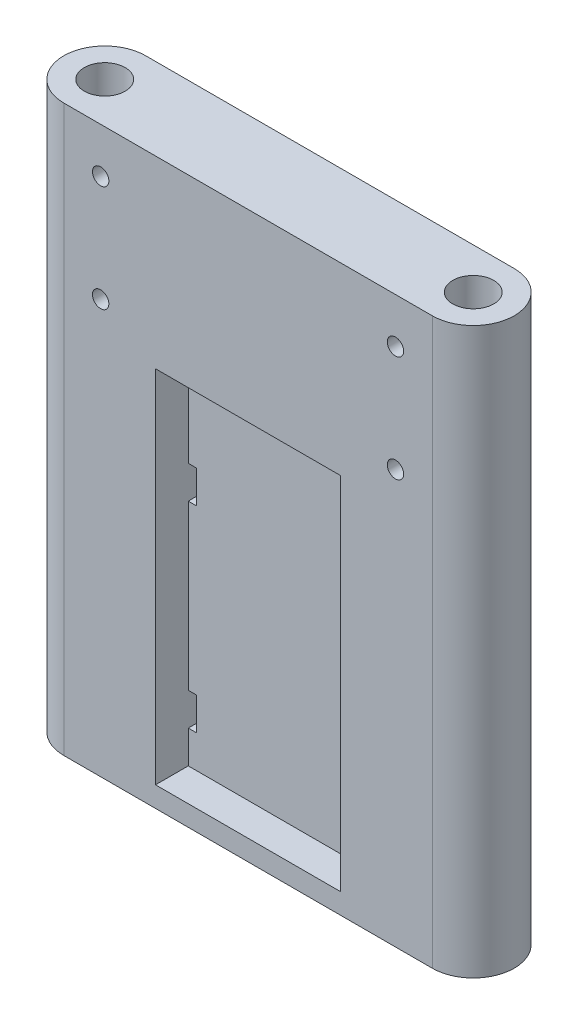
ISO-10303-21;
HEADER;
FILE_DESCRIPTION(('STEP AP214'),'2;1');
FILE_NAME('part.step','',(''),(''),'','','');
FILE_SCHEMA(('AUTOMOTIVE_DESIGN { 1 0 10303 214 1 1 1 1 }'));
ENDSEC;
DATA;
#1=APPLICATION_CONTEXT('core data for automotive mechanical design processes');
#2=APPLICATION_PROTOCOL_DEFINITION('international standard','automotive_design',2000,#1);
#3=PRODUCT_CONTEXT('',#1,'mechanical');
#4=PRODUCT('Part','Part','',(#3));
#5=PRODUCT_RELATED_PRODUCT_CATEGORY('part','',(#4));
#6=PRODUCT_DEFINITION_FORMATION('','',#4);
#7=PRODUCT_DEFINITION_CONTEXT('part definition',#1,'design');
#8=PRODUCT_DEFINITION('design','',#6,#7);
#9=PRODUCT_DEFINITION_SHAPE('','',#8);
#10=(LENGTH_UNIT() NAMED_UNIT(*) SI_UNIT(.MILLI.,.METRE.));
#11=(NAMED_UNIT(*) PLANE_ANGLE_UNIT() SI_UNIT($,.RADIAN.));
#12=(NAMED_UNIT(*) SI_UNIT($,.STERADIAN.) SOLID_ANGLE_UNIT());
#13=UNCERTAINTY_MEASURE_WITH_UNIT(LENGTH_MEASURE(1.E-05),#10,'distance_accuracy_value','');
#14=(GEOMETRIC_REPRESENTATION_CONTEXT(3) GLOBAL_UNCERTAINTY_ASSIGNED_CONTEXT((#13)) GLOBAL_UNIT_ASSIGNED_CONTEXT((#10,
#11,#12)) REPRESENTATION_CONTEXT('',''));
#15=CARTESIAN_POINT('',(0.,0.,0.));
#16=DIRECTION('',(0.,0.,1.));
#17=DIRECTION('',(1.,0.,0.));
#18=AXIS2_PLACEMENT_3D('',#15,#16,#17);
#19=CARTESIAN_POINT('',(0.,0.,1.27));
#20=DIRECTION('',(0.,0.,1.));
#21=DIRECTION('',(1.,0.,0.));
#22=AXIS2_PLACEMENT_3D('',#19,#20,#21);
#23=PLANE('',#22);
#24=DIRECTION('',(0.,-1.,0.));
#25=VECTOR('',#24,1.);
#26=CARTESIAN_POINT('',(-14.351,15.24,1.27));
#27=LINE('',#26,#25);
#28=CARTESIAN_POINT('',(-14.351,-5.07999999999999,1.27));
#29=VERTEX_POINT('',#28);
#30=CARTESIAN_POINT('',(-14.351,-30.48,1.27));
#31=VERTEX_POINT('',#30);
#32=EDGE_CURVE('E358',#29,#31,#27,.T.);
#33=ORIENTED_EDGE('',*,*,#32,.T.);
#34=DIRECTION('',(1.,0.,0.));
#35=VECTOR('',#34,1.);
#36=CARTESIAN_POINT('',(-13.081,-30.48,1.27));
#37=LINE('',#36,#35);
#38=CARTESIAN_POINT('',(-13.081,-30.48,1.27));
#39=VERTEX_POINT('',#38);
#40=EDGE_CURVE('E253',#31,#39,#37,.T.);
#41=ORIENTED_EDGE('',*,*,#40,.T.);
#42=DIRECTION('',(0.,-1.,0.));
#43=VECTOR('',#42,1.);
#44=CARTESIAN_POINT('',(-13.081,-35.56,1.27));
#45=LINE('',#44,#43);
#46=CARTESIAN_POINT('',(-13.081,-35.56,1.27));
#47=VERTEX_POINT('',#46);
#48=EDGE_CURVE('E239',#39,#47,#45,.T.);
#49=ORIENTED_EDGE('',*,*,#48,.T.);
#50=DIRECTION('',(-1.,0.,0.));
#51=VECTOR('',#50,1.);
#52=CARTESIAN_POINT('',(-13.081,-35.56,1.27));
#53=LINE('',#52,#51);
#54=CARTESIAN_POINT('',(-14.351,-35.56,1.27));
#55=VERTEX_POINT('',#54);
#56=EDGE_CURVE('E245',#47,#55,#53,.T.);
#57=ORIENTED_EDGE('',*,*,#56,.T.);
#58=CARTESIAN_POINT('',(-14.351,-40.64,1.27));
#59=VERTEX_POINT('',#58);
#60=EDGE_CURVE('E353',#55,#59,#27,.T.);
#61=ORIENTED_EDGE('',*,*,#60,.T.);
#62=DIRECTION('',(1.,0.,0.));
#63=VECTOR('',#62,1.);
#64=CARTESIAN_POINT('',(-14.351,-40.64,1.27));
#65=LINE('',#64,#63);
#66=CARTESIAN_POINT('',(14.351,-40.64,1.27));
#67=VERTEX_POINT('',#66);
#68=EDGE_CURVE('E357',#59,#67,#65,.T.);
#69=ORIENTED_EDGE('',*,*,#68,.T.);
#70=DIRECTION('',(0.,1.,0.));
#71=VECTOR('',#70,1.);
#72=CARTESIAN_POINT('',(14.351,15.24,1.27));
#73=LINE('',#72,#71);
#74=CARTESIAN_POINT('',(14.351,-35.56,1.27));
#75=VERTEX_POINT('',#74);
#76=EDGE_CURVE('E345',#67,#75,#73,.T.);
#77=ORIENTED_EDGE('',*,*,#76,.T.);
#78=DIRECTION('',(1.,0.,0.));
#79=VECTOR('',#78,1.);
#80=CARTESIAN_POINT('',(13.081,-35.56,1.27));
#81=LINE('',#80,#79);
#82=CARTESIAN_POINT('',(13.081,-35.56,1.27));
#83=VERTEX_POINT('',#82);
#84=EDGE_CURVE('E282',#83,#75,#81,.T.);
#85=ORIENTED_EDGE('',*,*,#84,.F.);
#86=DIRECTION('',(0.,-1.,0.));
#87=VECTOR('',#86,1.);
#88=CARTESIAN_POINT('',(13.081,-35.56,1.27));
#89=LINE('',#88,#87);
#90=CARTESIAN_POINT('',(13.081,-30.48,1.27));
#91=VERTEX_POINT('',#90);
#92=EDGE_CURVE('E279',#91,#83,#89,.T.);
#93=ORIENTED_EDGE('',*,*,#92,.F.);
#94=DIRECTION('',(-1.,0.,0.));
#95=VECTOR('',#94,1.);
#96=CARTESIAN_POINT('',(13.081,-30.48,1.27));
#97=LINE('',#96,#95);
#98=CARTESIAN_POINT('',(14.351,-30.48,1.27));
#99=VERTEX_POINT('',#98);
#100=EDGE_CURVE('E276',#99,#91,#97,.T.);
#101=ORIENTED_EDGE('',*,*,#100,.F.);
#102=CARTESIAN_POINT('',(14.351,-5.07999999999999,1.27));
#103=VERTEX_POINT('',#102);
#104=EDGE_CURVE('E349',#99,#103,#73,.T.);
#105=ORIENTED_EDGE('',*,*,#104,.T.);
#106=DIRECTION('',(1.,0.,0.));
#107=VECTOR('',#106,1.);
#108=CARTESIAN_POINT('',(13.081,-5.07999999999999,1.27));
#109=LINE('',#108,#107);
#110=CARTESIAN_POINT('',(13.081,-5.07999999999999,1.27));
#111=VERTEX_POINT('',#110);
#112=EDGE_CURVE('E299',#111,#103,#109,.T.);
#113=ORIENTED_EDGE('',*,*,#112,.F.);
#114=DIRECTION('',(0.,-1.,0.));
#115=VECTOR('',#114,1.);
#116=CARTESIAN_POINT('',(13.081,-5.07999999999999,1.27));
#117=LINE('',#116,#115);
#118=CARTESIAN_POINT('',(13.081,0.,1.27));
#119=VERTEX_POINT('',#118);
#120=EDGE_CURVE('E297',#119,#111,#117,.T.);
#121=ORIENTED_EDGE('',*,*,#120,.F.);
#122=DIRECTION('',(-1.,0.,0.));
#123=VECTOR('',#122,1.);
#124=CARTESIAN_POINT('',(13.081,0.,1.27));
#125=LINE('',#124,#123);
#126=CARTESIAN_POINT('',(14.351,0.,1.27));
#127=VERTEX_POINT('',#126);
#128=EDGE_CURVE('E259',#127,#119,#125,.T.);
#129=ORIENTED_EDGE('',*,*,#128,.F.);
#130=CARTESIAN_POINT('',(14.351,15.24,1.27));
#131=VERTEX_POINT('',#130);
#132=EDGE_CURVE('E350',#127,#131,#73,.T.);
#133=ORIENTED_EDGE('',*,*,#132,.T.);
#134=DIRECTION('',(-1.,0.,0.));
#135=VECTOR('',#134,1.);
#136=CARTESIAN_POINT('',(-14.351,15.24,1.27));
#137=LINE('',#136,#135);
#138=CARTESIAN_POINT('',(-14.351,15.24,1.27));
#139=VERTEX_POINT('',#138);
#140=EDGE_CURVE('E348',#131,#139,#137,.T.);
#141=ORIENTED_EDGE('',*,*,#140,.T.);
#142=CARTESIAN_POINT('',(-14.351,0.,1.27));
#143=VERTEX_POINT('',#142);
#144=EDGE_CURVE('E354',#139,#143,#27,.T.);
#145=ORIENTED_EDGE('',*,*,#144,.T.);
#146=DIRECTION('',(1.,0.,0.));
#147=VECTOR('',#146,1.);
#148=CARTESIAN_POINT('',(-13.081,0.,1.27));
#149=LINE('',#148,#147);
#150=CARTESIAN_POINT('',(-13.081,0.,1.27));
#151=VERTEX_POINT('',#150);
#152=EDGE_CURVE('E267',#143,#151,#149,.T.);
#153=ORIENTED_EDGE('',*,*,#152,.T.);
#154=DIRECTION('',(0.,-1.,0.));
#155=VECTOR('',#154,1.);
#156=CARTESIAN_POINT('',(-13.081,-5.07999999999999,1.27));
#157=LINE('',#156,#155);
#158=CARTESIAN_POINT('',(-13.081,-5.07999999999999,1.27));
#159=VERTEX_POINT('',#158);
#160=EDGE_CURVE('E264',#151,#159,#157,.T.);
#161=ORIENTED_EDGE('',*,*,#160,.T.);
#162=DIRECTION('',(-1.,0.,0.));
#163=VECTOR('',#162,1.);
#164=CARTESIAN_POINT('',(-13.081,-5.07999999999999,1.27));
#165=LINE('',#164,#163);
#166=EDGE_CURVE('E262',#159,#29,#165,.T.);
#167=ORIENTED_EDGE('',*,*,#166,.T.);
#168=EDGE_LOOP('',(#33,#41,#49,#57,#61,#69,#77,#85,#93,#101,#105,#113,#121,#129,#133,#141,#145,
#153,#161,#167));
#169=FACE_BOUND('',#168,.T.);
#170=ADVANCED_FACE('F48',(#169),#23,.T.);
#171=CARTESIAN_POINT('',(0.,0.,-1.27));
#172=DIRECTION('',(0.,0.,-1.));
#173=DIRECTION('',(1.,0.,0.));
#174=AXIS2_PLACEMENT_3D('',#171,#172,#173);
#175=PLANE('',#174);
#176=DIRECTION('',(0.,1.,0.));
#177=VECTOR('',#176,1.);
#178=CARTESIAN_POINT('',(-13.081,0.,-1.27));
#179=LINE('',#178,#177);
#180=CARTESIAN_POINT('',(-13.081,-35.56,-1.27));
#181=VERTEX_POINT('',#180);
#182=CARTESIAN_POINT('',(-13.081,-30.48,-1.27));
#183=VERTEX_POINT('',#182);
#184=EDGE_CURVE('E56',#181,#183,#179,.T.);
#185=ORIENTED_EDGE('',*,*,#184,.T.);
#186=DIRECTION('',(-1.,0.,0.));
#187=VECTOR('',#186,1.);
#188=CARTESIAN_POINT('',(0.,-30.48,-1.27));
#189=LINE('',#188,#187);
#190=CARTESIAN_POINT('',(-14.351,-30.48,-1.27));
#191=VERTEX_POINT('',#190);
#192=EDGE_CURVE('E13',#183,#191,#189,.T.);
#193=ORIENTED_EDGE('',*,*,#192,.T.);
#194=DIRECTION('',(0.,-1.,0.));
#195=VECTOR('',#194,1.);
#196=CARTESIAN_POINT('',(-14.351,15.24,-1.27));
#197=LINE('',#196,#195);
#198=CARTESIAN_POINT('',(-14.351,-5.07999999999999,-1.27));
#199=VERTEX_POINT('',#198);
#200=EDGE_CURVE('E322',#199,#191,#197,.T.);
#201=ORIENTED_EDGE('',*,*,#200,.F.);
#202=DIRECTION('',(1.,0.,0.));
#203=VECTOR('',#202,1.);
#204=CARTESIAN_POINT('',(0.,-5.07999999999999,-1.27));
#205=LINE('',#204,#203);
#206=CARTESIAN_POINT('',(-13.081,-5.07999999999999,-1.27));
#207=VERTEX_POINT('',#206);
#208=EDGE_CURVE('E460',#199,#207,#205,.T.);
#209=ORIENTED_EDGE('',*,*,#208,.T.);
#210=DIRECTION('',(0.,1.,0.));
#211=VECTOR('',#210,1.);
#212=CARTESIAN_POINT('',(-13.081,0.,-1.27));
#213=LINE('',#212,#211);
#214=CARTESIAN_POINT('',(-13.081,0.,-1.27));
#215=VERTEX_POINT('',#214);
#216=EDGE_CURVE('E463',#207,#215,#213,.T.);
#217=ORIENTED_EDGE('',*,*,#216,.T.);
#218=DIRECTION('',(-1.,0.,0.));
#219=VECTOR('',#218,1.);
#220=CARTESIAN_POINT('',(0.,0.,-1.27));
#221=LINE('',#220,#219);
#222=CARTESIAN_POINT('',(-14.351,0.,-1.27));
#223=VERTEX_POINT('',#222);
#224=EDGE_CURVE('E466',#215,#223,#221,.T.);
#225=ORIENTED_EDGE('',*,*,#224,.T.);
#226=CARTESIAN_POINT('',(-14.351,15.24,-1.27));
#227=VERTEX_POINT('',#226);
#228=EDGE_CURVE('E318',#227,#223,#197,.T.);
#229=ORIENTED_EDGE('',*,*,#228,.F.);
#230=DIRECTION('',(-1.,0.,0.));
#231=VECTOR('',#230,1.);
#232=CARTESIAN_POINT('',(-14.351,15.24,-1.27));
#233=LINE('',#232,#231);
#234=CARTESIAN_POINT('',(14.351,15.24,-1.27));
#235=VERTEX_POINT('',#234);
#236=EDGE_CURVE('E321',#235,#227,#233,.T.);
#237=ORIENTED_EDGE('',*,*,#236,.F.);
#238=DIRECTION('',(0.,1.,0.));
#239=VECTOR('',#238,1.);
#240=CARTESIAN_POINT('',(14.351,15.24,-1.27));
#241=LINE('',#240,#239);
#242=CARTESIAN_POINT('',(14.351,0.,-1.27));
#243=VERTEX_POINT('',#242);
#244=EDGE_CURVE('E315',#243,#235,#241,.T.);
#245=ORIENTED_EDGE('',*,*,#244,.F.);
#246=DIRECTION('',(1.,0.,0.));
#247=VECTOR('',#246,1.);
#248=CARTESIAN_POINT('',(0.,0.,-1.27));
#249=LINE('',#248,#247);
#250=CARTESIAN_POINT('',(13.081,0.,-1.27));
#251=VERTEX_POINT('',#250);
#252=EDGE_CURVE('E446',#251,#243,#249,.T.);
#253=ORIENTED_EDGE('',*,*,#252,.F.);
#254=DIRECTION('',(0.,1.,0.));
#255=VECTOR('',#254,1.);
#256=CARTESIAN_POINT('',(13.081,0.,-1.27));
#257=LINE('',#256,#255);
#258=CARTESIAN_POINT('',(13.081,-5.07999999999999,-1.27));
#259=VERTEX_POINT('',#258);
#260=EDGE_CURVE('E448',#259,#251,#257,.T.);
#261=ORIENTED_EDGE('',*,*,#260,.F.);
#262=DIRECTION('',(-1.,0.,0.));
#263=VECTOR('',#262,1.);
#264=CARTESIAN_POINT('',(0.,-5.07999999999999,-1.27));
#265=LINE('',#264,#263);
#266=CARTESIAN_POINT('',(14.351,-5.07999999999999,-1.27));
#267=VERTEX_POINT('',#266);
#268=EDGE_CURVE('E451',#267,#259,#265,.T.);
#269=ORIENTED_EDGE('',*,*,#268,.F.);
#270=CARTESIAN_POINT('',(14.351,-30.48,-1.27));
#271=VERTEX_POINT('',#270);
#272=EDGE_CURVE('E314',#271,#267,#241,.T.);
#273=ORIENTED_EDGE('',*,*,#272,.F.);
#274=DIRECTION('',(1.,0.,0.));
#275=VECTOR('',#274,1.);
#276=CARTESIAN_POINT('',(0.,-30.48,-1.27));
#277=LINE('',#276,#275);
#278=CARTESIAN_POINT('',(13.081,-30.48,-1.27));
#279=VERTEX_POINT('',#278);
#280=EDGE_CURVE('E453',#279,#271,#277,.T.);
#281=ORIENTED_EDGE('',*,*,#280,.F.);
#282=DIRECTION('',(0.,1.,0.));
#283=VECTOR('',#282,1.);
#284=CARTESIAN_POINT('',(13.081,0.,-1.27));
#285=LINE('',#284,#283);
#286=CARTESIAN_POINT('',(13.081,-35.56,-1.27));
#287=VERTEX_POINT('',#286);
#288=EDGE_CURVE('E455',#287,#279,#285,.T.);
#289=ORIENTED_EDGE('',*,*,#288,.F.);
#290=DIRECTION('',(-1.,0.,0.));
#291=VECTOR('',#290,1.);
#292=CARTESIAN_POINT('',(0.,-35.56,-1.27));
#293=LINE('',#292,#291);
#294=CARTESIAN_POINT('',(14.351,-35.56,-1.27));
#295=VERTEX_POINT('',#294);
#296=EDGE_CURVE('E458',#295,#287,#293,.T.);
#297=ORIENTED_EDGE('',*,*,#296,.F.);
#298=CARTESIAN_POINT('',(14.351,-40.64,-1.27));
#299=VERTEX_POINT('',#298);
#300=EDGE_CURVE('E310',#299,#295,#241,.T.);
#301=ORIENTED_EDGE('',*,*,#300,.F.);
#302=DIRECTION('',(1.,0.,0.));
#303=VECTOR('',#302,1.);
#304=CARTESIAN_POINT('',(-14.351,-40.64,-1.27));
#305=LINE('',#304,#303);
#306=CARTESIAN_POINT('',(-14.351,-40.64,-1.27));
#307=VERTEX_POINT('',#306);
#308=EDGE_CURVE('E313',#307,#299,#305,.T.);
#309=ORIENTED_EDGE('',*,*,#308,.F.);
#310=CARTESIAN_POINT('',(-14.351,-35.56,-1.27));
#311=VERTEX_POINT('',#310);
#312=EDGE_CURVE('E317',#311,#307,#197,.T.);
#313=ORIENTED_EDGE('',*,*,#312,.F.);
#314=DIRECTION('',(1.,0.,0.));
#315=VECTOR('',#314,1.);
#316=CARTESIAN_POINT('',(0.,-35.56,-1.27));
#317=LINE('',#316,#315);
#318=EDGE_CURVE('E469',#311,#181,#317,.T.);
#319=ORIENTED_EDGE('',*,*,#318,.T.);
#320=EDGE_LOOP('',(#185,#193,#201,#209,#217,#225,#229,#237,#245,#253,#261,#269,#273,#281,#289,
#297,#301,#309,#313,#319));
#321=FACE_BOUND('',#320,.T.);
#322=ADVANCED_FACE('F471',(#321),#175,.T.);
#323=CARTESIAN_POINT('',(-28.575,43.815,-6.35));
#324=DIRECTION('',(0.,0.,1.));
#325=DIRECTION('',(1.,0.,0.));
#326=AXIS2_PLACEMENT_3D('',#323,#324,#325);
#327=PLANE('',#326);
#328=DIRECTION('',(-1.,0.,0.));
#329=VECTOR('',#328,1.);
#330=CARTESIAN_POINT('',(-28.575,-43.815,-6.35));
#331=LINE('',#330,#329);
#332=CARTESIAN_POINT('',(28.575,-43.815,-6.35));
#333=VERTEX_POINT('',#332);
#334=CARTESIAN_POINT('',(-28.575,-43.815,-6.35));
#335=VERTEX_POINT('',#334);
#336=EDGE_CURVE('E421',#333,#335,#331,.T.);
#337=ORIENTED_EDGE('',*,*,#336,.T.);
#338=DIRECTION('',(0.,-1.,0.));
#339=VECTOR('',#338,1.);
#340=CARTESIAN_POINT('',(-28.575,43.815,-6.35));
#341=LINE('',#340,#339);
#342=CARTESIAN_POINT('',(-28.575,43.815,-6.35));
#343=VERTEX_POINT('',#342);
#344=EDGE_CURVE('E427',#343,#335,#341,.T.);
#345=ORIENTED_EDGE('',*,*,#344,.F.);
#346=DIRECTION('',(-1.,0.,0.));
#347=VECTOR('',#346,1.);
#348=CARTESIAN_POINT('',(-28.575,43.815,-6.35));
#349=LINE('',#348,#347);
#350=CARTESIAN_POINT('',(28.575,43.815,-6.35));
#351=VERTEX_POINT('',#350);
#352=EDGE_CURVE('E425',#351,#343,#349,.T.);
#353=ORIENTED_EDGE('',*,*,#352,.F.);
#354=DIRECTION('',(0.,-1.,0.));
#355=VECTOR('',#354,1.);
#356=CARTESIAN_POINT('',(28.575,43.815,-6.35));
#357=LINE('',#356,#355);
#358=EDGE_CURVE('E437',#351,#333,#357,.T.);
#359=ORIENTED_EDGE('',*,*,#358,.T.);
#360=EDGE_LOOP('',(#337,#345,#353,#359));
#361=FACE_BOUND('',#360,.T.);
#362=CARTESIAN_POINT('',(-22.86,36.83,-6.35));
#363=DIRECTION('',(0.,0.,-1.));
#364=DIRECTION('',(-1.,0.,0.));
#365=AXIS2_PLACEMENT_3D('',#362,#363,#364);
#366=CIRCLE('',#365,1.27);
#367=CARTESIAN_POINT('',(-24.13,36.83,-6.35));
#368=VERTEX_POINT('',#367);
#369=EDGE_CURVE('E399',#368,#368,#366,.T.);
#370=ORIENTED_EDGE('',*,*,#369,.F.);
#371=EDGE_LOOP('',(#370));
#372=FACE_BOUND('',#371,.T.);
#373=CARTESIAN_POINT('',(22.86,20.32,-6.35));
#374=DIRECTION('',(0.,0.,-1.));
#375=DIRECTION('',(-1.,0.,0.));
#376=AXIS2_PLACEMENT_3D('',#373,#374,#375);
#377=CIRCLE('',#376,1.27);
#378=CARTESIAN_POINT('',(21.59,20.32,-6.35));
#379=VERTEX_POINT('',#378);
#380=EDGE_CURVE('E392',#379,#379,#377,.T.);
#381=ORIENTED_EDGE('',*,*,#380,.F.);
#382=EDGE_LOOP('',(#381));
#383=FACE_BOUND('',#382,.T.);
#384=CARTESIAN_POINT('',(22.86,36.83,-6.35));
#385=DIRECTION('',(0.,0.,-1.));
#386=DIRECTION('',(-1.,0.,0.));
#387=AXIS2_PLACEMENT_3D('',#384,#385,#386);
#388=CIRCLE('',#387,1.27);
#389=CARTESIAN_POINT('',(21.59,36.83,-6.35));
#390=VERTEX_POINT('',#389);
#391=EDGE_CURVE('E395',#390,#390,#388,.T.);
#392=ORIENTED_EDGE('',*,*,#391,.F.);
#393=EDGE_LOOP('',(#392));
#394=FACE_BOUND('',#393,.T.);
#395=CARTESIAN_POINT('',(-22.86,20.32,-6.35));
#396=DIRECTION('',(0.,0.,-1.));
#397=DIRECTION('',(-1.,0.,0.));
#398=AXIS2_PLACEMENT_3D('',#395,#396,#397);
#399=CIRCLE('',#398,1.27);
#400=CARTESIAN_POINT('',(-24.13,20.32,-6.35));
#401=VERTEX_POINT('',#400);
#402=EDGE_CURVE('E396',#401,#401,#399,.T.);
#403=ORIENTED_EDGE('',*,*,#402,.F.);
#404=EDGE_LOOP('',(#403));
#405=FACE_BOUND('',#404,.T.);
#406=DIRECTION('',(0.,1.,0.));
#407=VECTOR('',#406,1.);
#408=CARTESIAN_POINT('',(14.351,15.24,-6.35));
#409=LINE('',#408,#407);
#410=CARTESIAN_POINT('',(14.351,-40.64,-6.35));
#411=VERTEX_POINT('',#410);
#412=CARTESIAN_POINT('',(14.351,15.24,-6.35));
#413=VERTEX_POINT('',#412);
#414=EDGE_CURVE('E288',#411,#413,#409,.T.);
#415=ORIENTED_EDGE('',*,*,#414,.T.);
#416=DIRECTION('',(-1.,0.,0.));
#417=VECTOR('',#416,1.);
#418=CARTESIAN_POINT('',(-14.351,15.24,-6.35));
#419=LINE('',#418,#417);
#420=CARTESIAN_POINT('',(-14.351,15.24,-6.35));
#421=VERTEX_POINT('',#420);
#422=EDGE_CURVE('E331',#413,#421,#419,.T.);
#423=ORIENTED_EDGE('',*,*,#422,.T.);
#424=DIRECTION('',(0.,-1.,0.));
#425=VECTOR('',#424,1.);
#426=CARTESIAN_POINT('',(-14.351,15.24,-6.35));
#427=LINE('',#426,#425);
#428=CARTESIAN_POINT('',(-14.351,-40.64,-6.35));
#429=VERTEX_POINT('',#428);
#430=EDGE_CURVE('E329',#421,#429,#427,.T.);
#431=ORIENTED_EDGE('',*,*,#430,.T.);
#432=DIRECTION('',(1.,0.,0.));
#433=VECTOR('',#432,1.);
#434=CARTESIAN_POINT('',(-14.351,-40.64,-6.35));
#435=LINE('',#434,#433);
#436=EDGE_CURVE('E326',#429,#411,#435,.T.);
#437=ORIENTED_EDGE('',*,*,#436,.T.);
#438=EDGE_LOOP('',(#415,#423,#431,#437));
#439=FACE_BOUND('',#438,.T.);
#440=ADVANCED_FACE('F500',(#361,#372,#383,#394,#405,#439),#327,.F.);
#441=CARTESIAN_POINT('',(-28.575,43.815,0.));
#442=DIRECTION('',(0.,1.,0.));
#443=DIRECTION('',(0.,0.,1.));
#444=AXIS2_PLACEMENT_3D('',#441,#442,#443);
#445=PLANE('',#444);
#446=CARTESIAN_POINT('',(28.575,43.815,0.));
#447=DIRECTION('',(0.,1.,0.));
#448=DIRECTION('',(0.,0.,1.));
#449=AXIS2_PLACEMENT_3D('',#446,#447,#448);
#450=CIRCLE('',#449,3.175);
#451=CARTESIAN_POINT('',(28.575,43.815,3.175));
#452=VERTEX_POINT('',#451);
#453=EDGE_CURVE('E411',#452,#452,#450,.T.);
#454=ORIENTED_EDGE('',*,*,#453,.F.);
#455=EDGE_LOOP('',(#454));
#456=FACE_BOUND('',#455,.T.);
#457=CARTESIAN_POINT('',(-28.575,43.815,0.));
#458=DIRECTION('',(0.,1.,0.));
#459=DIRECTION('',(0.,0.,1.));
#460=AXIS2_PLACEMENT_3D('',#457,#458,#459);
#461=CIRCLE('',#460,6.35);
#462=CARTESIAN_POINT('',(-28.575,43.815,6.35));
#463=VERTEX_POINT('',#462);
#464=EDGE_CURVE('E417',#343,#463,#461,.T.);
#465=ORIENTED_EDGE('',*,*,#464,.T.);
#466=DIRECTION('',(1.,0.,0.));
#467=VECTOR('',#466,1.);
#468=CARTESIAN_POINT('',(28.575,43.815,6.35));
#469=LINE('',#468,#467);
#470=CARTESIAN_POINT('',(28.575,43.815,6.35));
#471=VERTEX_POINT('',#470);
#472=EDGE_CURVE('E420',#463,#471,#469,.T.);
#473=ORIENTED_EDGE('',*,*,#472,.T.);
#474=CARTESIAN_POINT('',(28.575,43.815,0.));
#475=DIRECTION('',(0.,1.,0.));
#476=DIRECTION('',(0.,0.,1.));
#477=AXIS2_PLACEMENT_3D('',#474,#475,#476);
#478=CIRCLE('',#477,6.35);
#479=EDGE_CURVE('E423',#471,#351,#478,.T.);
#480=ORIENTED_EDGE('',*,*,#479,.T.);
#481=ORIENTED_EDGE('',*,*,#352,.T.);
#482=EDGE_LOOP('',(#465,#473,#480,#481));
#483=FACE_BOUND('',#482,.T.);
#484=CARTESIAN_POINT('',(-28.575,43.815,0.));
#485=DIRECTION('',(0.,1.,0.));
#486=DIRECTION('',(0.,0.,1.));
#487=AXIS2_PLACEMENT_3D('',#484,#485,#486);
#488=CIRCLE('',#487,3.175);
#489=CARTESIAN_POINT('',(-28.575,43.815,3.175));
#490=VERTEX_POINT('',#489);
#491=EDGE_CURVE('E405',#490,#490,#488,.T.);
#492=ORIENTED_EDGE('',*,*,#491,.F.);
#493=EDGE_LOOP('',(#492));
#494=FACE_BOUND('',#493,.T.);
#495=ADVANCED_FACE('F546',(#456,#483,#494),#445,.T.);
#496=CARTESIAN_POINT('',(-28.575,-43.815,0.));
#497=DIRECTION('',(0.,1.,0.));
#498=DIRECTION('',(0.,0.,1.));
#499=AXIS2_PLACEMENT_3D('',#496,#497,#498);
#500=PLANE('',#499);
#501=CARTESIAN_POINT('',(-28.575,-43.815,0.));
#502=DIRECTION('',(0.,1.,0.));
#503=DIRECTION('',(0.,0.,1.));
#504=AXIS2_PLACEMENT_3D('',#501,#502,#503);
#505=CIRCLE('',#504,6.35);
#506=CARTESIAN_POINT('',(-28.575,-43.815,6.35));
#507=VERTEX_POINT('',#506);
#508=EDGE_CURVE('E414',#335,#507,#505,.T.);
#509=ORIENTED_EDGE('',*,*,#508,.F.);
#510=ORIENTED_EDGE('',*,*,#336,.F.);
#511=CARTESIAN_POINT('',(28.575,-43.815,0.));
#512=DIRECTION('',(0.,1.,0.));
#513=DIRECTION('',(0.,0.,1.));
#514=AXIS2_PLACEMENT_3D('',#511,#512,#513);
#515=CIRCLE('',#514,6.35);
#516=CARTESIAN_POINT('',(28.575,-43.815,6.35));
#517=VERTEX_POINT('',#516);
#518=EDGE_CURVE('E432',#517,#333,#515,.T.);
#519=ORIENTED_EDGE('',*,*,#518,.F.);
#520=DIRECTION('',(1.,0.,0.));
#521=VECTOR('',#520,1.);
#522=CARTESIAN_POINT('',(28.575,-43.815,6.35));
#523=LINE('',#522,#521);
#524=EDGE_CURVE('E430',#507,#517,#523,.T.);
#525=ORIENTED_EDGE('',*,*,#524,.F.);
#526=EDGE_LOOP('',(#509,#510,#519,#525));
#527=FACE_BOUND('',#526,.T.);
#528=CARTESIAN_POINT('',(28.575,-43.815,0.));
#529=DIRECTION('',(0.,1.,0.));
#530=DIRECTION('',(0.,0.,1.));
#531=AXIS2_PLACEMENT_3D('',#528,#529,#530);
#532=CIRCLE('',#531,3.175);
#533=CARTESIAN_POINT('',(28.575,-43.815,3.175));
#534=VERTEX_POINT('',#533);
#535=EDGE_CURVE('E408',#534,#534,#532,.T.);
#536=ORIENTED_EDGE('',*,*,#535,.T.);
#537=EDGE_LOOP('',(#536));
#538=FACE_BOUND('',#537,.T.);
#539=CARTESIAN_POINT('',(-28.575,-43.815,0.));
#540=DIRECTION('',(0.,1.,0.));
#541=DIRECTION('',(0.,0.,1.));
#542=AXIS2_PLACEMENT_3D('',#539,#540,#541);
#543=CIRCLE('',#542,3.175);
#544=CARTESIAN_POINT('',(-28.575,-43.815,3.175));
#545=VERTEX_POINT('',#544);
#546=EDGE_CURVE('E404',#545,#545,#543,.T.);
#547=ORIENTED_EDGE('',*,*,#546,.T.);
#548=EDGE_LOOP('',(#547));
#549=FACE_BOUND('',#548,.T.);
#550=ADVANCED_FACE('F549',(#527,#538,#549),#500,.F.);
#551=CARTESIAN_POINT('',(-28.575,43.815,0.));
#552=DIRECTION('',(0.,-1.,0.));
#553=DIRECTION('',(0.,0.,-1.));
#554=AXIS2_PLACEMENT_3D('',#551,#552,#553);
#555=CYLINDRICAL_SURFACE('',#554,6.35);
#556=ORIENTED_EDGE('',*,*,#508,.T.);
#557=DIRECTION('',(0.,-1.,0.));
#558=VECTOR('',#557,1.);
#559=CARTESIAN_POINT('',(-28.575,43.815,6.35));
#560=LINE('',#559,#558);
#561=EDGE_CURVE('E443',#463,#507,#560,.T.);
#562=ORIENTED_EDGE('',*,*,#561,.F.);
#563=ORIENTED_EDGE('',*,*,#464,.F.);
#564=ORIENTED_EDGE('',*,*,#344,.T.);
#565=EDGE_LOOP('',(#556,#562,#563,#564));
#566=FACE_BOUND('',#565,.T.);
#567=ADVANCED_FACE('F50',(#566),#555,.T.);
#568=CARTESIAN_POINT('',(28.575,43.815,6.35));
#569=DIRECTION('',(0.,0.,-1.));
#570=DIRECTION('',(-1.,0.,0.));
#571=AXIS2_PLACEMENT_3D('',#568,#569,#570);
#572=PLANE('',#571);
#573=DIRECTION('',(-1.,0.,0.));
#574=VECTOR('',#573,1.);
#575=CARTESIAN_POINT('',(-14.351,15.24,6.35));
#576=LINE('',#575,#574);
#577=CARTESIAN_POINT('',(14.351,15.24,6.35));
#578=VERTEX_POINT('',#577);
#579=CARTESIAN_POINT('',(-14.351,15.24,6.35));
#580=VERTEX_POINT('',#579);
#581=EDGE_CURVE('E363',#578,#580,#576,.T.);
#582=ORIENTED_EDGE('',*,*,#581,.F.);
#583=DIRECTION('',(0.,1.,0.));
#584=VECTOR('',#583,1.);
#585=CARTESIAN_POINT('',(14.351,15.24,6.35));
#586=LINE('',#585,#584);
#587=CARTESIAN_POINT('',(14.351,-40.64,6.35));
#588=VERTEX_POINT('',#587);
#589=EDGE_CURVE('E337',#588,#578,#586,.T.);
#590=ORIENTED_EDGE('',*,*,#589,.F.);
#591=DIRECTION('',(1.,0.,0.));
#592=VECTOR('',#591,1.);
#593=CARTESIAN_POINT('',(-14.351,-40.64,6.35));
#594=LINE('',#593,#592);
#595=CARTESIAN_POINT('',(-14.351,-40.64,6.35));
#596=VERTEX_POINT('',#595);
#597=EDGE_CURVE('E369',#596,#588,#594,.T.);
#598=ORIENTED_EDGE('',*,*,#597,.F.);
#599=DIRECTION('',(0.,-1.,0.));
#600=VECTOR('',#599,1.);
#601=CARTESIAN_POINT('',(-14.351,15.24,6.35));
#602=LINE('',#601,#600);
#603=EDGE_CURVE('E366',#580,#596,#602,.T.);
#604=ORIENTED_EDGE('',*,*,#603,.F.);
#605=EDGE_LOOP('',(#582,#590,#598,#604));
#606=FACE_BOUND('',#605,.T.);
#607=CARTESIAN_POINT('',(22.86,20.32,6.35));
#608=DIRECTION('',(0.,0.,1.));
#609=DIRECTION('',(1.,0.,0.));
#610=AXIS2_PLACEMENT_3D('',#607,#608,#609);
#611=CIRCLE('',#610,1.27);
#612=CARTESIAN_POINT('',(24.13,20.32,6.35));
#613=VERTEX_POINT('',#612);
#614=EDGE_CURVE('E384',#613,#613,#611,.T.);
#615=ORIENTED_EDGE('',*,*,#614,.F.);
#616=EDGE_LOOP('',(#615));
#617=FACE_BOUND('',#616,.T.);
#618=CARTESIAN_POINT('',(-22.86,36.83,6.35));
#619=DIRECTION('',(0.,0.,1.));
#620=DIRECTION('',(1.,0.,0.));
#621=AXIS2_PLACEMENT_3D('',#618,#619,#620);
#622=CIRCLE('',#621,1.27);
#623=CARTESIAN_POINT('',(-21.59,36.83,6.35));
#624=VERTEX_POINT('',#623);
#625=EDGE_CURVE('E383',#624,#624,#622,.T.);
#626=ORIENTED_EDGE('',*,*,#625,.F.);
#627=EDGE_LOOP('',(#626));
#628=FACE_BOUND('',#627,.T.);
#629=CARTESIAN_POINT('',(-22.86,20.32,6.35));
#630=DIRECTION('',(0.,0.,1.));
#631=DIRECTION('',(1.,0.,0.));
#632=AXIS2_PLACEMENT_3D('',#629,#630,#631);
#633=CIRCLE('',#632,1.27);
#634=CARTESIAN_POINT('',(-21.59,20.32,6.35));
#635=VERTEX_POINT('',#634);
#636=EDGE_CURVE('E374',#635,#635,#633,.T.);
#637=ORIENTED_EDGE('',*,*,#636,.F.);
#638=EDGE_LOOP('',(#637));
#639=FACE_BOUND('',#638,.T.);
#640=CARTESIAN_POINT('',(22.86,36.83,6.35));
#641=DIRECTION('',(0.,0.,1.));
#642=DIRECTION('',(1.,0.,0.));
#643=AXIS2_PLACEMENT_3D('',#640,#641,#642);
#644=CIRCLE('',#643,1.27);
#645=CARTESIAN_POINT('',(24.13,36.83,6.35));
#646=VERTEX_POINT('',#645);
#647=EDGE_CURVE('E387',#646,#646,#644,.T.);
#648=ORIENTED_EDGE('',*,*,#647,.F.);
#649=EDGE_LOOP('',(#648));
#650=FACE_BOUND('',#649,.T.);
#651=ORIENTED_EDGE('',*,*,#524,.T.);
#652=DIRECTION('',(0.,-1.,0.));
#653=VECTOR('',#652,1.);
#654=CARTESIAN_POINT('',(28.575,43.815,6.35));
#655=LINE('',#654,#653);
#656=EDGE_CURVE('E440',#471,#517,#655,.T.);
#657=ORIENTED_EDGE('',*,*,#656,.F.);
#658=ORIENTED_EDGE('',*,*,#472,.F.);
#659=ORIENTED_EDGE('',*,*,#561,.T.);
#660=EDGE_LOOP('',(#651,#657,#658,#659));
#661=FACE_BOUND('',#660,.T.);
#662=ADVANCED_FACE('F558',(#606,#617,#628,#639,#650,#661),#572,.F.);
#663=CARTESIAN_POINT('',(28.575,43.815,0.));
#664=DIRECTION('',(0.,-1.,0.));
#665=DIRECTION('',(0.,0.,-1.));
#666=AXIS2_PLACEMENT_3D('',#663,#664,#665);
#667=CYLINDRICAL_SURFACE('',#666,6.35);
#668=ORIENTED_EDGE('',*,*,#518,.T.);
#669=ORIENTED_EDGE('',*,*,#358,.F.);
#670=ORIENTED_EDGE('',*,*,#479,.F.);
#671=ORIENTED_EDGE('',*,*,#656,.T.);
#672=EDGE_LOOP('',(#668,#669,#670,#671));
#673=FACE_BOUND('',#672,.T.);
#674=ADVANCED_FACE('F544',(#673),#667,.T.);
#675=CARTESIAN_POINT('',(28.575,43.815,0.));
#676=DIRECTION('',(0.,-1.,0.));
#677=DIRECTION('',(0.,0.,-1.));
#678=AXIS2_PLACEMENT_3D('',#675,#676,#677);
#679=CYLINDRICAL_SURFACE('',#678,3.175);
#680=ORIENTED_EDGE('',*,*,#453,.T.);
#681=EDGE_LOOP('',(#680));
#682=FACE_BOUND('',#681,.T.);
#683=ORIENTED_EDGE('',*,*,#535,.F.);
#684=EDGE_LOOP('',(#683));
#685=FACE_BOUND('',#684,.T.);
#686=ADVANCED_FACE('F540',(#682,#685),#679,.F.);
#687=CARTESIAN_POINT('',(-28.575,43.815,0.));
#688=DIRECTION('',(0.,-1.,0.));
#689=DIRECTION('',(0.,0.,-1.));
#690=AXIS2_PLACEMENT_3D('',#687,#688,#689);
#691=CYLINDRICAL_SURFACE('',#690,3.175);
#692=ORIENTED_EDGE('',*,*,#491,.T.);
#693=EDGE_LOOP('',(#692));
#694=FACE_BOUND('',#693,.T.);
#695=ORIENTED_EDGE('',*,*,#546,.F.);
#696=EDGE_LOOP('',(#695));
#697=FACE_BOUND('',#696,.T.);
#698=ADVANCED_FACE('F536',(#694,#697),#691,.F.);
#699=CARTESIAN_POINT('',(-22.86,36.83,-1.27));
#700=DIRECTION('',(0.,0.,-1.));
#701=DIRECTION('',(-1.,0.,0.));
#702=AXIS2_PLACEMENT_3D('',#699,#700,#701);
#703=CYLINDRICAL_SURFACE('',#702,1.27);
#704=ORIENTED_EDGE('',*,*,#369,.T.);
#705=EDGE_LOOP('',(#704));
#706=FACE_BOUND('',#705,.T.);
#707=ORIENTED_EDGE('',*,*,#625,.T.);
#708=EDGE_LOOP('',(#707));
#709=FACE_BOUND('',#708,.T.);
#710=ADVANCED_FACE('F526',(#706,#709),#703,.F.);
#711=CARTESIAN_POINT('',(22.86,20.32,-1.27));
#712=DIRECTION('',(0.,0.,-1.));
#713=DIRECTION('',(-1.,0.,0.));
#714=AXIS2_PLACEMENT_3D('',#711,#712,#713);
#715=CYLINDRICAL_SURFACE('',#714,1.27);
#716=ORIENTED_EDGE('',*,*,#380,.T.);
#717=EDGE_LOOP('',(#716));
#718=FACE_BOUND('',#717,.T.);
#719=ORIENTED_EDGE('',*,*,#614,.T.);
#720=EDGE_LOOP('',(#719));
#721=FACE_BOUND('',#720,.T.);
#722=ADVANCED_FACE('F522',(#718,#721),#715,.F.);
#723=CARTESIAN_POINT('',(22.86,36.83,-1.27));
#724=DIRECTION('',(0.,0.,-1.));
#725=DIRECTION('',(-1.,0.,0.));
#726=AXIS2_PLACEMENT_3D('',#723,#724,#725);
#727=CYLINDRICAL_SURFACE('',#726,1.27);
#728=ORIENTED_EDGE('',*,*,#391,.T.);
#729=EDGE_LOOP('',(#728));
#730=FACE_BOUND('',#729,.T.);
#731=ORIENTED_EDGE('',*,*,#647,.T.);
#732=EDGE_LOOP('',(#731));
#733=FACE_BOUND('',#732,.T.);
#734=ADVANCED_FACE('F525',(#730,#733),#727,.F.);
#735=CARTESIAN_POINT('',(-22.86,20.32,-1.27));
#736=DIRECTION('',(0.,0.,-1.));
#737=DIRECTION('',(-1.,0.,0.));
#738=AXIS2_PLACEMENT_3D('',#735,#736,#737);
#739=CYLINDRICAL_SURFACE('',#738,1.27);
#740=ORIENTED_EDGE('',*,*,#402,.T.);
#741=EDGE_LOOP('',(#740));
#742=FACE_BOUND('',#741,.T.);
#743=ORIENTED_EDGE('',*,*,#636,.T.);
#744=EDGE_LOOP('',(#743));
#745=FACE_BOUND('',#744,.T.);
#746=ADVANCED_FACE('F520',(#742,#745),#739,.F.);
#747=CARTESIAN_POINT('',(14.351,15.24,1.27));
#748=DIRECTION('',(1.,0.,0.));
#749=DIRECTION('',(0.,1.,0.));
#750=AXIS2_PLACEMENT_3D('',#747,#748,#749);
#751=PLANE('',#750);
#752=ORIENTED_EDGE('',*,*,#104,.F.);
#753=DIRECTION('',(0.,0.,1.));
#754=VECTOR('',#753,1.);
#755=CARTESIAN_POINT('',(14.351,-30.48,-6.35));
#756=LINE('',#755,#754);
#757=EDGE_CURVE('E285',#271,#99,#756,.T.);
#758=ORIENTED_EDGE('',*,*,#757,.F.);
#759=ORIENTED_EDGE('',*,*,#272,.T.);
#760=DIRECTION('',(0.,0.,1.));
#761=VECTOR('',#760,1.);
#762=CARTESIAN_POINT('',(14.351,-5.07999999999999,-6.35));
#763=LINE('',#762,#761);
#764=EDGE_CURVE('E280',#267,#103,#763,.T.);
#765=ORIENTED_EDGE('',*,*,#764,.T.);
#766=EDGE_LOOP('',(#752,#758,#759,#765));
#767=FACE_BOUND('',#766,.T.);
#768=ORIENTED_EDGE('',*,*,#589,.T.);
#769=DIRECTION('',(0.,0.,1.));
#770=VECTOR('',#769,1.);
#771=CARTESIAN_POINT('',(14.351,15.24,1.27));
#772=LINE('',#771,#770);
#773=EDGE_CURVE('E361',#131,#578,#772,.T.);
#774=ORIENTED_EDGE('',*,*,#773,.F.);
#775=ORIENTED_EDGE('',*,*,#132,.F.);
#776=DIRECTION('',(0.,0.,1.));
#777=VECTOR('',#776,1.);
#778=CARTESIAN_POINT('',(14.351,0.,-6.35));
#779=LINE('',#778,#777);
#780=EDGE_CURVE('E302',#243,#127,#779,.T.);
#781=ORIENTED_EDGE('',*,*,#780,.F.);
#782=ORIENTED_EDGE('',*,*,#244,.T.);
#783=DIRECTION('',(0.,0.,-1.));
#784=VECTOR('',#783,1.);
#785=CARTESIAN_POINT('',(14.351,15.24,-1.27));
#786=LINE('',#785,#784);
#787=EDGE_CURVE('E334',#235,#413,#786,.T.);
#788=ORIENTED_EDGE('',*,*,#787,.T.);
#789=ORIENTED_EDGE('',*,*,#414,.F.);
#790=DIRECTION('',(0.,0.,-1.));
#791=VECTOR('',#790,1.);
#792=CARTESIAN_POINT('',(14.351,-40.64,-1.27));
#793=LINE('',#792,#791);
#794=EDGE_CURVE('E324',#299,#411,#793,.T.);
#795=ORIENTED_EDGE('',*,*,#794,.F.);
#796=ORIENTED_EDGE('',*,*,#300,.T.);
#797=DIRECTION('',(0.,0.,1.));
#798=VECTOR('',#797,1.);
#799=CARTESIAN_POINT('',(14.351,-35.56,-6.35));
#800=LINE('',#799,#798);
#801=EDGE_CURVE('E286',#295,#75,#800,.T.);
#802=ORIENTED_EDGE('',*,*,#801,.T.);
#803=ORIENTED_EDGE('',*,*,#76,.F.);
#804=DIRECTION('',(0.,0.,1.));
#805=VECTOR('',#804,1.);
#806=CARTESIAN_POINT('',(14.351,-40.64,1.27));
#807=LINE('',#806,#805);
#808=EDGE_CURVE('E372',#67,#588,#807,.T.);
#809=ORIENTED_EDGE('',*,*,#808,.T.);
#810=EDGE_LOOP('',(#768,#774,#775,#781,#782,#788,#789,#795,#796,#802,#803,#809));
#811=FACE_BOUND('',#810,.T.);
#812=ADVANCED_FACE('F509',(#767,#811),#751,.F.);
#813=CARTESIAN_POINT('',(-14.351,-40.64,1.27));
#814=DIRECTION('',(0.,-1.,0.));
#815=DIRECTION('',(0.,0.,-1.));
#816=AXIS2_PLACEMENT_3D('',#813,#814,#815);
#817=PLANE('',#816);
#818=ORIENTED_EDGE('',*,*,#597,.T.);
#819=ORIENTED_EDGE('',*,*,#808,.F.);
#820=ORIENTED_EDGE('',*,*,#68,.F.);
#821=DIRECTION('',(0.,0.,1.));
#822=VECTOR('',#821,1.);
#823=CARTESIAN_POINT('',(-14.351,-40.64,1.27));
#824=LINE('',#823,#822);
#825=EDGE_CURVE('E375',#59,#596,#824,.T.);
#826=ORIENTED_EDGE('',*,*,#825,.T.);
#827=EDGE_LOOP('',(#818,#819,#820,#826));
#828=FACE_BOUND('',#827,.T.);
#829=ADVANCED_FACE('F506',(#828),#817,.F.);
#830=CARTESIAN_POINT('',(-14.351,15.24,1.27));
#831=DIRECTION('',(-1.,0.,0.));
#832=DIRECTION('',(0.,-1.,0.));
#833=AXIS2_PLACEMENT_3D('',#830,#831,#832);
#834=PLANE('',#833);
#835=DIRECTION('',(0.,0.,1.));
#836=VECTOR('',#835,1.);
#837=CARTESIAN_POINT('',(-14.351,-30.48,-6.35));
#838=LINE('',#837,#836);
#839=EDGE_CURVE('E257',#191,#31,#838,.T.);
#840=ORIENTED_EDGE('',*,*,#839,.T.);
#841=ORIENTED_EDGE('',*,*,#32,.F.);
#842=DIRECTION('',(0.,0.,1.));
#843=VECTOR('',#842,1.);
#844=CARTESIAN_POINT('',(-14.351,-5.07999999999999,-6.35));
#845=LINE('',#844,#843);
#846=EDGE_CURVE('E71',#199,#29,#845,.T.);
#847=ORIENTED_EDGE('',*,*,#846,.F.);
#848=ORIENTED_EDGE('',*,*,#200,.T.);
#849=EDGE_LOOP('',(#840,#841,#847,#848));
#850=FACE_BOUND('',#849,.T.);
#851=ORIENTED_EDGE('',*,*,#603,.T.);
#852=ORIENTED_EDGE('',*,*,#825,.F.);
#853=ORIENTED_EDGE('',*,*,#60,.F.);
#854=DIRECTION('',(0.,0.,1.));
#855=VECTOR('',#854,1.);
#856=CARTESIAN_POINT('',(-14.351,-35.56,-6.35));
#857=LINE('',#856,#855);
#858=EDGE_CURVE('E63',#311,#55,#857,.T.);
#859=ORIENTED_EDGE('',*,*,#858,.F.);
#860=ORIENTED_EDGE('',*,*,#312,.T.);
#861=DIRECTION('',(0.,0.,-1.));
#862=VECTOR('',#861,1.);
#863=CARTESIAN_POINT('',(-14.351,-40.64,-1.27));
#864=LINE('',#863,#862);
#865=EDGE_CURVE('E340',#307,#429,#864,.T.);
#866=ORIENTED_EDGE('',*,*,#865,.T.);
#867=ORIENTED_EDGE('',*,*,#430,.F.);
#868=DIRECTION('',(0.,0.,-1.));
#869=VECTOR('',#868,1.);
#870=CARTESIAN_POINT('',(-14.351,15.24,-1.27));
#871=LINE('',#870,#869);
#872=EDGE_CURVE('E338',#227,#421,#871,.T.);
#873=ORIENTED_EDGE('',*,*,#872,.F.);
#874=ORIENTED_EDGE('',*,*,#228,.T.);
#875=DIRECTION('',(0.,0.,1.));
#876=VECTOR('',#875,1.);
#877=CARTESIAN_POINT('',(-14.351,0.,-6.35));
#878=LINE('',#877,#876);
#879=EDGE_CURVE('E249',#223,#143,#878,.T.);
#880=ORIENTED_EDGE('',*,*,#879,.T.);
#881=ORIENTED_EDGE('',*,*,#144,.F.);
#882=DIRECTION('',(0.,0.,1.));
#883=VECTOR('',#882,1.);
#884=CARTESIAN_POINT('',(-14.351,15.24,1.27));
#885=LINE('',#884,#883);
#886=EDGE_CURVE('E377',#139,#580,#885,.T.);
#887=ORIENTED_EDGE('',*,*,#886,.T.);
#888=EDGE_LOOP('',(#851,#852,#853,#859,#860,#866,#867,#873,#874,#880,#881,#887));
#889=FACE_BOUND('',#888,.T.);
#890=ADVANCED_FACE('F477',(#850,#889),#834,.F.);
#891=CARTESIAN_POINT('',(-14.351,15.24,1.27));
#892=DIRECTION('',(0.,1.,0.));
#893=DIRECTION('',(0.,0.,1.));
#894=AXIS2_PLACEMENT_3D('',#891,#892,#893);
#895=PLANE('',#894);
#896=ORIENTED_EDGE('',*,*,#581,.T.);
#897=ORIENTED_EDGE('',*,*,#886,.F.);
#898=ORIENTED_EDGE('',*,*,#140,.F.);
#899=ORIENTED_EDGE('',*,*,#773,.T.);
#900=EDGE_LOOP('',(#896,#897,#898,#899));
#901=FACE_BOUND('',#900,.T.);
#902=ADVANCED_FACE('F513',(#901),#895,.F.);
#903=CARTESIAN_POINT('',(-14.351,15.24,-1.27));
#904=DIRECTION('',(0.,-1.,0.));
#905=DIRECTION('',(0.,0.,-1.));
#906=AXIS2_PLACEMENT_3D('',#903,#904,#905);
#907=PLANE('',#906);
#908=ORIENTED_EDGE('',*,*,#422,.F.);
#909=ORIENTED_EDGE('',*,*,#787,.F.);
#910=ORIENTED_EDGE('',*,*,#236,.T.);
#911=ORIENTED_EDGE('',*,*,#872,.T.);
#912=EDGE_LOOP('',(#908,#909,#910,#911));
#913=FACE_BOUND('',#912,.T.);
#914=ADVANCED_FACE('F516',(#913),#907,.T.);
#915=CARTESIAN_POINT('',(-14.351,-40.64,-1.27));
#916=DIRECTION('',(0.,1.,0.));
#917=DIRECTION('',(0.,0.,1.));
#918=AXIS2_PLACEMENT_3D('',#915,#916,#917);
#919=PLANE('',#918);
#920=ORIENTED_EDGE('',*,*,#436,.F.);
#921=ORIENTED_EDGE('',*,*,#865,.F.);
#922=ORIENTED_EDGE('',*,*,#308,.T.);
#923=ORIENTED_EDGE('',*,*,#794,.T.);
#924=EDGE_LOOP('',(#920,#921,#922,#923));
#925=FACE_BOUND('',#924,.T.);
#926=ADVANCED_FACE('F504',(#925),#919,.T.);
#927=CARTESIAN_POINT('',(13.081,-5.07999999999999,-6.35));
#928=DIRECTION('',(0.,-1.,0.));
#929=DIRECTION('',(0.,0.,-1.));
#930=AXIS2_PLACEMENT_3D('',#927,#928,#929);
#931=PLANE('',#930);
#932=ORIENTED_EDGE('',*,*,#268,.T.);
#933=DIRECTION('',(0.,0.,1.));
#934=VECTOR('',#933,1.);
#935=CARTESIAN_POINT('',(13.081,-5.07999999999999,-6.35));
#936=LINE('',#935,#934);
#937=EDGE_CURVE('E304',#259,#111,#936,.T.);
#938=ORIENTED_EDGE('',*,*,#937,.T.);
#939=ORIENTED_EDGE('',*,*,#112,.T.);
#940=ORIENTED_EDGE('',*,*,#764,.F.);
#941=EDGE_LOOP('',(#932,#938,#939,#940));
#942=FACE_BOUND('',#941,.T.);
#943=ADVANCED_FACE('F646',(#942),#931,.F.);
#944=CARTESIAN_POINT('',(13.081,-5.07999999999999,-6.35));
#945=DIRECTION('',(-1.,0.,0.));
#946=DIRECTION('',(0.,0.,1.));
#947=AXIS2_PLACEMENT_3D('',#944,#945,#946);
#948=PLANE('',#947);
#949=ORIENTED_EDGE('',*,*,#260,.T.);
#950=DIRECTION('',(0.,0.,1.));
#951=VECTOR('',#950,1.);
#952=CARTESIAN_POINT('',(13.081,0.,-6.35));
#953=LINE('',#952,#951);
#954=EDGE_CURVE('E307',#251,#119,#953,.T.);
#955=ORIENTED_EDGE('',*,*,#954,.T.);
#956=ORIENTED_EDGE('',*,*,#120,.T.);
#957=ORIENTED_EDGE('',*,*,#937,.F.);
#958=EDGE_LOOP('',(#949,#955,#956,#957));
#959=FACE_BOUND('',#958,.T.);
#960=ADVANCED_FACE('F650',(#959),#948,.F.);
#961=CARTESIAN_POINT('',(13.081,0.,-6.35));
#962=DIRECTION('',(0.,1.,0.));
#963=DIRECTION('',(0.,0.,1.));
#964=AXIS2_PLACEMENT_3D('',#961,#962,#963);
#965=PLANE('',#964);
#966=ORIENTED_EDGE('',*,*,#252,.T.);
#967=ORIENTED_EDGE('',*,*,#780,.T.);
#968=ORIENTED_EDGE('',*,*,#128,.T.);
#969=ORIENTED_EDGE('',*,*,#954,.F.);
#970=EDGE_LOOP('',(#966,#967,#968,#969));
#971=FACE_BOUND('',#970,.T.);
#972=ADVANCED_FACE('F652',(#971),#965,.F.);
#973=CARTESIAN_POINT('',(13.081,-35.56,-6.35));
#974=DIRECTION('',(0.,-1.,0.));
#975=DIRECTION('',(0.,0.,-1.));
#976=AXIS2_PLACEMENT_3D('',#973,#974,#975);
#977=PLANE('',#976);
#978=ORIENTED_EDGE('',*,*,#296,.T.);
#979=DIRECTION('',(0.,0.,1.));
#980=VECTOR('',#979,1.);
#981=CARTESIAN_POINT('',(13.081,-35.56,-6.35));
#982=LINE('',#981,#980);
#983=EDGE_CURVE('E289',#287,#83,#982,.T.);
#984=ORIENTED_EDGE('',*,*,#983,.T.);
#985=ORIENTED_EDGE('',*,*,#84,.T.);
#986=ORIENTED_EDGE('',*,*,#801,.F.);
#987=EDGE_LOOP('',(#978,#984,#985,#986));
#988=FACE_BOUND('',#987,.T.);
#989=ADVANCED_FACE('F625',(#988),#977,.F.);
#990=CARTESIAN_POINT('',(13.081,-35.56,-6.35));
#991=DIRECTION('',(-1.,0.,0.));
#992=DIRECTION('',(0.,0.,1.));
#993=AXIS2_PLACEMENT_3D('',#990,#991,#992);
#994=PLANE('',#993);
#995=ORIENTED_EDGE('',*,*,#288,.T.);
#996=DIRECTION('',(0.,0.,1.));
#997=VECTOR('',#996,1.);
#998=CARTESIAN_POINT('',(13.081,-30.48,-6.35));
#999=LINE('',#998,#997);
#1000=EDGE_CURVE('E292',#279,#91,#999,.T.);
#1001=ORIENTED_EDGE('',*,*,#1000,.T.);
#1002=ORIENTED_EDGE('',*,*,#92,.T.);
#1003=ORIENTED_EDGE('',*,*,#983,.F.);
#1004=EDGE_LOOP('',(#995,#1001,#1002,#1003));
#1005=FACE_BOUND('',#1004,.T.);
#1006=ADVANCED_FACE('F628',(#1005),#994,.F.);
#1007=CARTESIAN_POINT('',(13.081,-30.48,-6.35));
#1008=DIRECTION('',(0.,1.,0.));
#1009=DIRECTION('',(0.,0.,1.));
#1010=AXIS2_PLACEMENT_3D('',#1007,#1008,#1009);
#1011=PLANE('',#1010);
#1012=ORIENTED_EDGE('',*,*,#280,.T.);
#1013=ORIENTED_EDGE('',*,*,#757,.T.);
#1014=ORIENTED_EDGE('',*,*,#100,.T.);
#1015=ORIENTED_EDGE('',*,*,#1000,.F.);
#1016=EDGE_LOOP('',(#1012,#1013,#1014,#1015));
#1017=FACE_BOUND('',#1016,.T.);
#1018=ADVANCED_FACE('F672',(#1017),#1011,.F.);
#1019=CARTESIAN_POINT('',(-13.081,0.,-6.35));
#1020=DIRECTION('',(0.,-1.,0.));
#1021=DIRECTION('',(0.,0.,-1.));
#1022=AXIS2_PLACEMENT_3D('',#1019,#1020,#1021);
#1023=PLANE('',#1022);
#1024=DIRECTION('',(0.,0.,1.));
#1025=VECTOR('',#1024,1.);
#1026=CARTESIAN_POINT('',(-13.081,0.,-6.35));
#1027=LINE('',#1026,#1025);
#1028=EDGE_CURVE('E271',#215,#151,#1027,.T.);
#1029=ORIENTED_EDGE('',*,*,#1028,.T.);
#1030=ORIENTED_EDGE('',*,*,#152,.F.);
#1031=ORIENTED_EDGE('',*,*,#879,.F.);
#1032=ORIENTED_EDGE('',*,*,#224,.F.);
#1033=EDGE_LOOP('',(#1029,#1030,#1031,#1032));
#1034=FACE_BOUND('',#1033,.T.);
#1035=ADVANCED_FACE('F675',(#1034),#1023,.T.);
#1036=CARTESIAN_POINT('',(-13.081,-5.07999999999999,-6.35));
#1037=DIRECTION('',(-1.,0.,0.));
#1038=DIRECTION('',(0.,0.,1.));
#1039=AXIS2_PLACEMENT_3D('',#1036,#1037,#1038);
#1040=PLANE('',#1039);
#1041=DIRECTION('',(0.,0.,1.));
#1042=VECTOR('',#1041,1.);
#1043=CARTESIAN_POINT('',(-13.081,-5.07999999999999,-6.35));
#1044=LINE('',#1043,#1042);
#1045=EDGE_CURVE('E273',#207,#159,#1044,.T.);
#1046=ORIENTED_EDGE('',*,*,#1045,.T.);
#1047=ORIENTED_EDGE('',*,*,#160,.F.);
#1048=ORIENTED_EDGE('',*,*,#1028,.F.);
#1049=ORIENTED_EDGE('',*,*,#216,.F.);
#1050=EDGE_LOOP('',(#1046,#1047,#1048,#1049));
#1051=FACE_BOUND('',#1050,.T.);
#1052=ADVANCED_FACE('F493',(#1051),#1040,.T.);
#1053=CARTESIAN_POINT('',(-13.081,-5.07999999999999,-6.35));
#1054=DIRECTION('',(0.,1.,0.));
#1055=DIRECTION('',(0.,0.,1.));
#1056=AXIS2_PLACEMENT_3D('',#1053,#1054,#1055);
#1057=PLANE('',#1056);
#1058=ORIENTED_EDGE('',*,*,#846,.T.);
#1059=ORIENTED_EDGE('',*,*,#166,.F.);
#1060=ORIENTED_EDGE('',*,*,#1045,.F.);
#1061=ORIENTED_EDGE('',*,*,#208,.F.);
#1062=EDGE_LOOP('',(#1058,#1059,#1060,#1061));
#1063=FACE_BOUND('',#1062,.T.);
#1064=ADVANCED_FACE('F486',(#1063),#1057,.T.);
#1065=CARTESIAN_POINT('',(-13.081,-30.48,-6.35));
#1066=DIRECTION('',(0.,-1.,0.));
#1067=DIRECTION('',(0.,0.,-1.));
#1068=AXIS2_PLACEMENT_3D('',#1065,#1066,#1067);
#1069=PLANE('',#1068);
#1070=DIRECTION('',(0.,0.,1.));
#1071=VECTOR('',#1070,1.);
#1072=CARTESIAN_POINT('',(-13.081,-30.48,-6.35));
#1073=LINE('',#1072,#1071);
#1074=EDGE_CURVE('E243',#183,#39,#1073,.T.);
#1075=ORIENTED_EDGE('',*,*,#1074,.T.);
#1076=ORIENTED_EDGE('',*,*,#40,.F.);
#1077=ORIENTED_EDGE('',*,*,#839,.F.);
#1078=ORIENTED_EDGE('',*,*,#192,.F.);
#1079=EDGE_LOOP('',(#1075,#1076,#1077,#1078));
#1080=FACE_BOUND('',#1079,.T.);
#1081=ADVANCED_FACE('F484',(#1080),#1069,.T.);
#1082=CARTESIAN_POINT('',(-13.081,-35.56,-6.35));
#1083=DIRECTION('',(-1.,0.,0.));
#1084=DIRECTION('',(0.,0.,1.));
#1085=AXIS2_PLACEMENT_3D('',#1082,#1083,#1084);
#1086=PLANE('',#1085);
#1087=DIRECTION('',(0.,0.,1.));
#1088=VECTOR('',#1087,1.);
#1089=CARTESIAN_POINT('',(-13.081,-35.56,-6.35));
#1090=LINE('',#1089,#1088);
#1091=EDGE_CURVE('E235',#181,#47,#1090,.T.);
#1092=ORIENTED_EDGE('',*,*,#1091,.T.);
#1093=ORIENTED_EDGE('',*,*,#48,.F.);
#1094=ORIENTED_EDGE('',*,*,#1074,.F.);
#1095=ORIENTED_EDGE('',*,*,#184,.F.);
#1096=EDGE_LOOP('',(#1092,#1093,#1094,#1095));
#1097=FACE_BOUND('',#1096,.T.);
#1098=ADVANCED_FACE('F236',(#1097),#1086,.T.);
#1099=CARTESIAN_POINT('',(-13.081,-35.56,-6.35));
#1100=DIRECTION('',(0.,1.,0.));
#1101=DIRECTION('',(0.,0.,1.));
#1102=AXIS2_PLACEMENT_3D('',#1099,#1100,#1101);
#1103=PLANE('',#1102);
#1104=ORIENTED_EDGE('',*,*,#858,.T.);
#1105=ORIENTED_EDGE('',*,*,#56,.F.);
#1106=ORIENTED_EDGE('',*,*,#1091,.F.);
#1107=ORIENTED_EDGE('',*,*,#318,.F.);
#1108=EDGE_LOOP('',(#1104,#1105,#1106,#1107));
#1109=FACE_BOUND('',#1108,.T.);
#1110=ADVANCED_FACE('F246',(#1109),#1103,.T.);
#1111=CLOSED_SHELL('',(#170,#322,#440,#495,#550,#567,#662,#674,#686,#698,#710,#722,#734,#746,
#812,#829,#890,#902,#914,#926,#943,#960,#972,#989,#1006,#1018,#1035,#1052,#1064,#1081,#1098,#1110));
#1112=MANIFOLD_SOLID_BREP('B2',#1111);
#1113=ADVANCED_BREP_SHAPE_REPRESENTATION('',(#18,#1112),#14);
#1114=SHAPE_DEFINITION_REPRESENTATION(#9,#1113);
ENDSEC;
END-ISO-10303-21;
